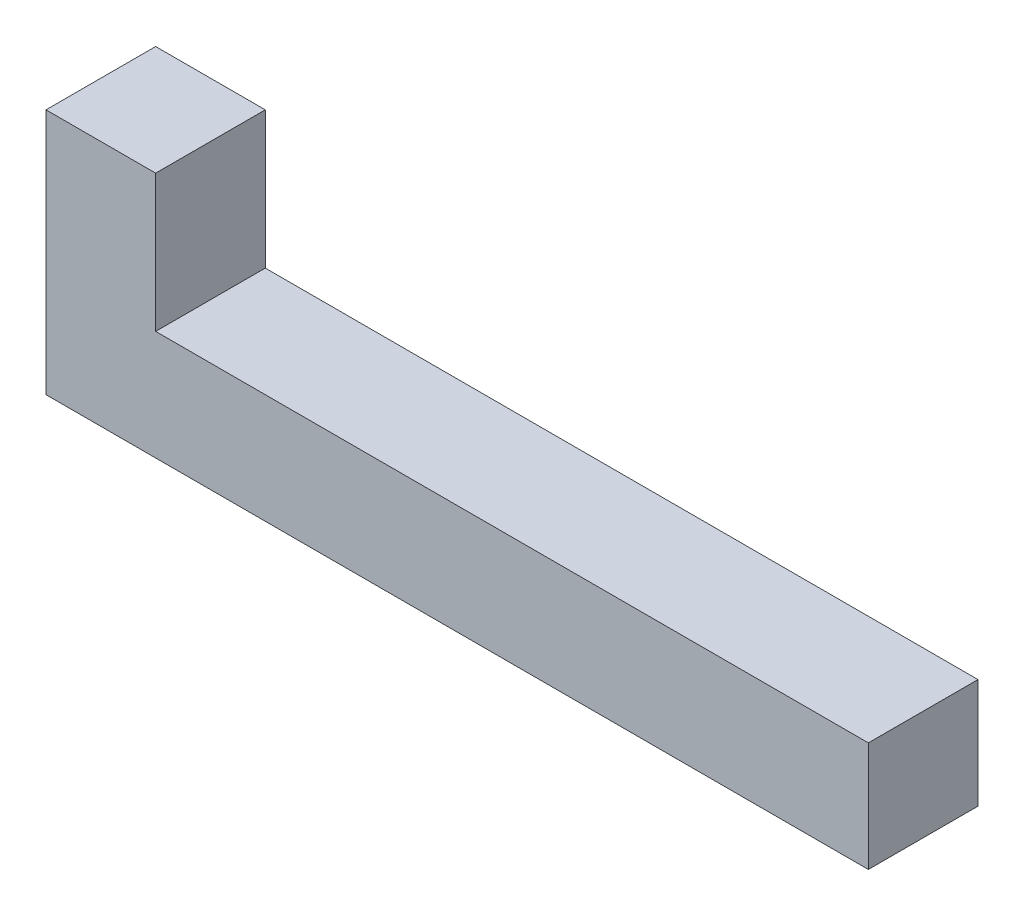
ISO-10303-21;
HEADER;
FILE_DESCRIPTION(('STEP AP214'),'2;1');
FILE_NAME('part.step','',(''),(''),'','','');
FILE_SCHEMA(('AUTOMOTIVE_DESIGN { 1 0 10303 214 1 1 1 1 }'));
ENDSEC;
DATA;
#1=APPLICATION_CONTEXT('core data for automotive mechanical design processes');
#2=APPLICATION_PROTOCOL_DEFINITION('international standard','automotive_design',2000,#1);
#3=PRODUCT_CONTEXT('',#1,'mechanical');
#4=PRODUCT('Part','Part','',(#3));
#5=PRODUCT_RELATED_PRODUCT_CATEGORY('part','',(#4));
#6=PRODUCT_DEFINITION_FORMATION('','',#4);
#7=PRODUCT_DEFINITION_CONTEXT('part definition',#1,'design');
#8=PRODUCT_DEFINITION('design','',#6,#7);
#9=PRODUCT_DEFINITION_SHAPE('','',#8);
#10=(LENGTH_UNIT() NAMED_UNIT(*) SI_UNIT(.MILLI.,.METRE.));
#11=(NAMED_UNIT(*) PLANE_ANGLE_UNIT() SI_UNIT($,.RADIAN.));
#12=(NAMED_UNIT(*) SI_UNIT($,.STERADIAN.) SOLID_ANGLE_UNIT());
#13=UNCERTAINTY_MEASURE_WITH_UNIT(LENGTH_MEASURE(1.E-05),#10,'distance_accuracy_value','');
#14=(GEOMETRIC_REPRESENTATION_CONTEXT(3) GLOBAL_UNCERTAINTY_ASSIGNED_CONTEXT((#13)) GLOBAL_UNIT_ASSIGNED_CONTEXT((#10,
#11,#12)) REPRESENTATION_CONTEXT('',''));
#15=CARTESIAN_POINT('',(0.,0.,0.));
#16=DIRECTION('',(0.,0.,1.));
#17=DIRECTION('',(1.,0.,0.));
#18=AXIS2_PLACEMENT_3D('',#15,#16,#17);
#19=CARTESIAN_POINT('',(0.,0.,200.));
#20=DIRECTION('',(1.,0.,0.));
#21=DIRECTION('',(0.,0.,-1.));
#22=AXIS2_PLACEMENT_3D('',#19,#20,#21);
#23=PLANE('',#22);
#24=DIRECTION('',(0.,-1.,0.));
#25=VECTOR('',#24,1.);
#26=CARTESIAN_POINT('',(0.,0.,0.));
#27=LINE('',#26,#25);
#28=CARTESIAN_POINT('',(0.,0.,0.));
#29=VERTEX_POINT('',#28);
#30=CARTESIAN_POINT('',(0.,-450.,0.));
#31=VERTEX_POINT('',#30);
#32=EDGE_CURVE('E128',#29,#31,#27,.T.);
#33=ORIENTED_EDGE('',*,*,#32,.T.);
#34=DIRECTION('',(0.,0.,-1.));
#35=VECTOR('',#34,1.);
#36=CARTESIAN_POINT('',(0.,-450.,200.));
#37=LINE('',#36,#35);
#38=CARTESIAN_POINT('',(0.,-450.,200.));
#39=VERTEX_POINT('',#38);
#40=EDGE_CURVE('E11',#39,#31,#37,.T.);
#41=ORIENTED_EDGE('',*,*,#40,.F.);
#42=DIRECTION('',(0.,-1.,0.));
#43=VECTOR('',#42,1.);
#44=CARTESIAN_POINT('',(0.,0.,200.));
#45=LINE('',#44,#43);
#46=CARTESIAN_POINT('',(0.,0.,200.));
#47=VERTEX_POINT('',#46);
#48=EDGE_CURVE('E144',#47,#39,#45,.T.);
#49=ORIENTED_EDGE('',*,*,#48,.F.);
#50=DIRECTION('',(0.,0.,-1.));
#51=VECTOR('',#50,1.);
#52=CARTESIAN_POINT('',(0.,0.,200.));
#53=LINE('',#52,#51);
#54=EDGE_CURVE('E124',#47,#29,#53,.T.);
#55=ORIENTED_EDGE('',*,*,#54,.T.);
#56=EDGE_LOOP('',(#33,#41,#49,#55));
#57=FACE_BOUND('',#56,.T.);
#58=ADVANCED_FACE('F39',(#57),#23,.F.);
#59=CARTESIAN_POINT('',(264.062231020829,-450.,200.));
#60=DIRECTION('',(0.,1.,0.));
#61=DIRECTION('',(0.,0.,1.));
#62=AXIS2_PLACEMENT_3D('',#59,#60,#61);
#63=PLANE('',#62);
#64=DIRECTION('',(1.,0.,0.));
#65=VECTOR('',#64,1.);
#66=CARTESIAN_POINT('',(264.062231020829,-450.,0.));
#67=LINE('',#66,#65);
#68=CARTESIAN_POINT('',(1500.,-450.,0.));
#69=VERTEX_POINT('',#68);
#70=EDGE_CURVE('E132',#31,#69,#67,.T.);
#71=ORIENTED_EDGE('',*,*,#70,.T.);
#72=DIRECTION('',(0.,0.,-1.));
#73=VECTOR('',#72,1.);
#74=CARTESIAN_POINT('',(1500.,-450.,200.));
#75=LINE('',#74,#73);
#76=CARTESIAN_POINT('',(1500.,-450.,200.));
#77=VERTEX_POINT('',#76);
#78=EDGE_CURVE('E48',#77,#69,#75,.T.);
#79=ORIENTED_EDGE('',*,*,#78,.F.);
#80=DIRECTION('',(1.,0.,0.));
#81=VECTOR('',#80,1.);
#82=CARTESIAN_POINT('',(0.,-450.,200.));
#83=LINE('',#82,#81);
#84=EDGE_CURVE('E93',#39,#77,#83,.T.);
#85=ORIENTED_EDGE('',*,*,#84,.F.);
#86=ORIENTED_EDGE('',*,*,#40,.T.);
#87=EDGE_LOOP('',(#71,#79,#85,#86));
#88=FACE_BOUND('',#87,.T.);
#89=ADVANCED_FACE('F172',(#88),#63,.F.);
#90=CARTESIAN_POINT('',(1500.,-450.,200.));
#91=DIRECTION('',(-1.,0.,0.));
#92=DIRECTION('',(0.,0.,1.));
#93=AXIS2_PLACEMENT_3D('',#90,#91,#92);
#94=PLANE('',#93);
#95=DIRECTION('',(0.,1.,0.));
#96=VECTOR('',#95,1.);
#97=CARTESIAN_POINT('',(1500.,-450.,0.));
#98=LINE('',#97,#96);
#99=CARTESIAN_POINT('',(1500.,-250.,0.));
#100=VERTEX_POINT('',#99);
#101=EDGE_CURVE('E135',#69,#100,#98,.T.);
#102=ORIENTED_EDGE('',*,*,#101,.T.);
#103=DIRECTION('',(0.,0.,-1.));
#104=VECTOR('',#103,1.);
#105=CARTESIAN_POINT('',(1500.,-250.,200.));
#106=LINE('',#105,#104);
#107=CARTESIAN_POINT('',(1500.,-250.,200.));
#108=VERTEX_POINT('',#107);
#109=EDGE_CURVE('E117',#108,#100,#106,.T.);
#110=ORIENTED_EDGE('',*,*,#109,.F.);
#111=DIRECTION('',(0.,1.,0.));
#112=VECTOR('',#111,1.);
#113=CARTESIAN_POINT('',(1500.,-450.,200.));
#114=LINE('',#113,#112);
#115=EDGE_CURVE('E106',#77,#108,#114,.T.);
#116=ORIENTED_EDGE('',*,*,#115,.F.);
#117=ORIENTED_EDGE('',*,*,#78,.T.);
#118=EDGE_LOOP('',(#102,#110,#116,#117));
#119=FACE_BOUND('',#118,.T.);
#120=ADVANCED_FACE('F154',(#119),#94,.F.);
#121=CARTESIAN_POINT('',(200.,-250.,200.));
#122=DIRECTION('',(0.,-1.,0.));
#123=DIRECTION('',(0.,0.,-1.));
#124=AXIS2_PLACEMENT_3D('',#121,#122,#123);
#125=PLANE('',#124);
#126=DIRECTION('',(-1.,0.,0.));
#127=VECTOR('',#126,1.);
#128=CARTESIAN_POINT('',(200.,-250.,0.));
#129=LINE('',#128,#127);
#130=CARTESIAN_POINT('',(200.,-250.,0.));
#131=VERTEX_POINT('',#130);
#132=EDGE_CURVE('E115',#100,#131,#129,.T.);
#133=ORIENTED_EDGE('',*,*,#132,.T.);
#134=DIRECTION('',(0.,0.,-1.));
#135=VECTOR('',#134,1.);
#136=CARTESIAN_POINT('',(200.,-250.,200.));
#137=LINE('',#136,#135);
#138=CARTESIAN_POINT('',(200.,-250.,200.));
#139=VERTEX_POINT('',#138);
#140=EDGE_CURVE('E112',#139,#131,#137,.T.);
#141=ORIENTED_EDGE('',*,*,#140,.F.);
#142=DIRECTION('',(-1.,0.,0.));
#143=VECTOR('',#142,1.);
#144=CARTESIAN_POINT('',(200.,-250.,200.));
#145=LINE('',#144,#143);
#146=EDGE_CURVE('E100',#108,#139,#145,.T.);
#147=ORIENTED_EDGE('',*,*,#146,.F.);
#148=ORIENTED_EDGE('',*,*,#109,.T.);
#149=EDGE_LOOP('',(#133,#141,#147,#148));
#150=FACE_BOUND('',#149,.T.);
#151=ADVANCED_FACE('F113',(#150),#125,.F.);
#152=CARTESIAN_POINT('',(200.,0.,200.));
#153=DIRECTION('',(-1.,0.,0.));
#154=DIRECTION('',(0.,-1.,0.));
#155=AXIS2_PLACEMENT_3D('',#152,#153,#154);
#156=PLANE('',#155);
#157=DIRECTION('',(0.,1.,0.));
#158=VECTOR('',#157,1.);
#159=CARTESIAN_POINT('',(200.,0.,0.));
#160=LINE('',#159,#158);
#161=CARTESIAN_POINT('',(200.,0.,0.));
#162=VERTEX_POINT('',#161);
#163=EDGE_CURVE('E79',#131,#162,#160,.T.);
#164=ORIENTED_EDGE('',*,*,#163,.T.);
#165=DIRECTION('',(0.,0.,-1.));
#166=VECTOR('',#165,1.);
#167=CARTESIAN_POINT('',(200.,0.,200.));
#168=LINE('',#167,#166);
#169=CARTESIAN_POINT('',(200.,0.,200.));
#170=VERTEX_POINT('',#169);
#171=EDGE_CURVE('E118',#170,#162,#168,.T.);
#172=ORIENTED_EDGE('',*,*,#171,.F.);
#173=DIRECTION('',(0.,1.,0.));
#174=VECTOR('',#173,1.);
#175=CARTESIAN_POINT('',(200.,0.,200.));
#176=LINE('',#175,#174);
#177=EDGE_CURVE('E104',#139,#170,#176,.T.);
#178=ORIENTED_EDGE('',*,*,#177,.F.);
#179=ORIENTED_EDGE('',*,*,#140,.T.);
#180=EDGE_LOOP('',(#164,#172,#178,#179));
#181=FACE_BOUND('',#180,.T.);
#182=ADVANCED_FACE('F120',(#181),#156,.F.);
#183=CARTESIAN_POINT('',(0.,0.,200.));
#184=DIRECTION('',(0.,-1.,0.));
#185=DIRECTION('',(0.,0.,-1.));
#186=AXIS2_PLACEMENT_3D('',#183,#184,#185);
#187=PLANE('',#186);
#188=DIRECTION('',(-1.,0.,0.));
#189=VECTOR('',#188,1.);
#190=CARTESIAN_POINT('',(0.,0.,0.));
#191=LINE('',#190,#189);
#192=EDGE_CURVE('E85',#162,#29,#191,.T.);
#193=ORIENTED_EDGE('',*,*,#192,.T.);
#194=ORIENTED_EDGE('',*,*,#54,.F.);
#195=DIRECTION('',(-1.,0.,0.));
#196=VECTOR('',#195,1.);
#197=CARTESIAN_POINT('',(0.,0.,200.));
#198=LINE('',#197,#196);
#199=EDGE_CURVE('E56',#170,#47,#198,.T.);
#200=ORIENTED_EDGE('',*,*,#199,.F.);
#201=ORIENTED_EDGE('',*,*,#171,.T.);
#202=EDGE_LOOP('',(#193,#194,#200,#201));
#203=FACE_BOUND('',#202,.T.);
#204=ADVANCED_FACE('F161',(#203),#187,.F.);
#205=CARTESIAN_POINT('',(0.,0.,200.));
#206=DIRECTION('',(0.,0.,1.));
#207=DIRECTION('',(1.,0.,0.));
#208=AXIS2_PLACEMENT_3D('',#205,#206,#207);
#209=PLANE('',#208);
#210=ORIENTED_EDGE('',*,*,#48,.T.);
#211=ORIENTED_EDGE('',*,*,#84,.T.);
#212=ORIENTED_EDGE('',*,*,#115,.T.);
#213=ORIENTED_EDGE('',*,*,#146,.T.);
#214=ORIENTED_EDGE('',*,*,#177,.T.);
#215=ORIENTED_EDGE('',*,*,#199,.T.);
#216=EDGE_LOOP('',(#210,#211,#212,#213,#214,#215));
#217=FACE_BOUND('',#216,.T.);
#218=ADVANCED_FACE('F102',(#217),#209,.T.);
#219=CARTESIAN_POINT('',(0.,0.,0.));
#220=DIRECTION('',(0.,0.,1.));
#221=DIRECTION('',(1.,0.,0.));
#222=AXIS2_PLACEMENT_3D('',#219,#220,#221);
#223=PLANE('',#222);
#224=ORIENTED_EDGE('',*,*,#32,.F.);
#225=ORIENTED_EDGE('',*,*,#192,.F.);
#226=ORIENTED_EDGE('',*,*,#163,.F.);
#227=ORIENTED_EDGE('',*,*,#132,.F.);
#228=ORIENTED_EDGE('',*,*,#101,.F.);
#229=ORIENTED_EDGE('',*,*,#70,.F.);
#230=EDGE_LOOP('',(#224,#225,#226,#227,#228,#229));
#231=FACE_BOUND('',#230,.T.);
#232=ADVANCED_FACE('F157',(#231),#223,.F.);
#233=CLOSED_SHELL('',(#58,#89,#120,#151,#182,#204,#218,#232));
#234=MANIFOLD_SOLID_BREP('B2',#233);
#235=ADVANCED_BREP_SHAPE_REPRESENTATION('',(#18,#234),#14);
#236=SHAPE_DEFINITION_REPRESENTATION(#9,#235);
ENDSEC;
END-ISO-10303-21;
